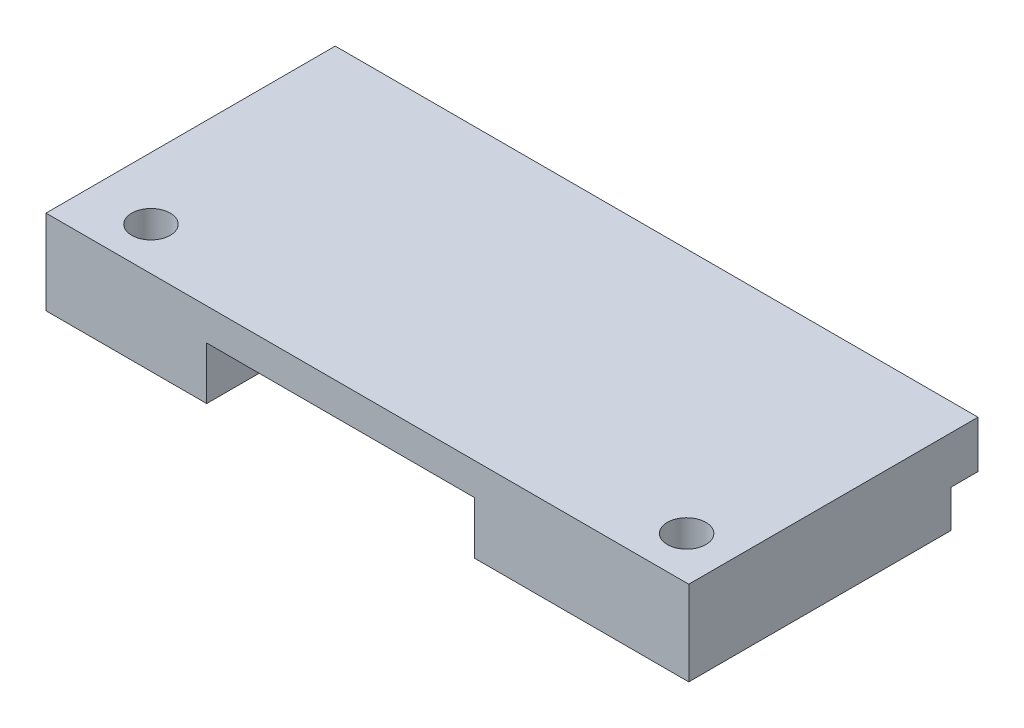
ISO-10303-21;
HEADER;
FILE_DESCRIPTION(('STEP AP214'),'2;1');
FILE_NAME('part.step','',(''),(''),'','','');
FILE_SCHEMA(('AUTOMOTIVE_DESIGN { 1 0 10303 214 1 1 1 1 }'));
ENDSEC;
DATA;
#1=APPLICATION_CONTEXT('core data for automotive mechanical design processes');
#2=APPLICATION_PROTOCOL_DEFINITION('international standard','automotive_design',2000,#1);
#3=PRODUCT_CONTEXT('',#1,'mechanical');
#4=PRODUCT('Part','Part','',(#3));
#5=PRODUCT_RELATED_PRODUCT_CATEGORY('part','',(#4));
#6=PRODUCT_DEFINITION_FORMATION('','',#4);
#7=PRODUCT_DEFINITION_CONTEXT('part definition',#1,'design');
#8=PRODUCT_DEFINITION('design','',#6,#7);
#9=PRODUCT_DEFINITION_SHAPE('','',#8);
#10=(LENGTH_UNIT() NAMED_UNIT(*) SI_UNIT(.MILLI.,.METRE.));
#11=(NAMED_UNIT(*) PLANE_ANGLE_UNIT() SI_UNIT($,.RADIAN.));
#12=(NAMED_UNIT(*) SI_UNIT($,.STERADIAN.) SOLID_ANGLE_UNIT());
#13=UNCERTAINTY_MEASURE_WITH_UNIT(LENGTH_MEASURE(1.E-05),#10,'distance_accuracy_value','');
#14=(GEOMETRIC_REPRESENTATION_CONTEXT(3) GLOBAL_UNCERTAINTY_ASSIGNED_CONTEXT((#13)) GLOBAL_UNIT_ASSIGNED_CONTEXT((#10,
#11,#12)) REPRESENTATION_CONTEXT('',''));
#15=CARTESIAN_POINT('',(0.,0.,0.));
#16=DIRECTION('',(0.,0.,1.));
#17=DIRECTION('',(1.,0.,0.));
#18=AXIS2_PLACEMENT_3D('',#15,#16,#17);
#19=CARTESIAN_POINT('',(30.,2.5,1.25));
#20=DIRECTION('',(-1.,0.,0.));
#21=DIRECTION('',(0.,0.,1.));
#22=AXIS2_PLACEMENT_3D('',#19,#20,#21);
#23=PLANE('',#22);
#24=DIRECTION('',(0.,0.,1.));
#25=VECTOR('',#24,1.);
#26=CARTESIAN_POINT('',(30.,3.5,-3.75));
#27=LINE('',#26,#25);
#28=CARTESIAN_POINT('',(30.,3.5,-3.75));
#29=VERTEX_POINT('',#28);
#30=CARTESIAN_POINT('',(30.,3.5,-1.25));
#31=VERTEX_POINT('',#30);
#32=EDGE_CURVE('E132',#29,#31,#27,.T.);
#33=ORIENTED_EDGE('',*,*,#32,.F.);
#34=DIRECTION('',(0.,-1.,0.));
#35=VECTOR('',#34,1.);
#36=CARTESIAN_POINT('',(30.,5.5,-3.75));
#37=LINE('',#36,#35);
#38=CARTESIAN_POINT('',(30.,7.9,-3.75));
#39=VERTEX_POINT('',#38);
#40=EDGE_CURVE('E148',#39,#29,#37,.T.);
#41=ORIENTED_EDGE('',*,*,#40,.F.);
#42=DIRECTION('',(0.,0.,-1.));
#43=VECTOR('',#42,1.);
#44=CARTESIAN_POINT('',(30.,7.9,23.25));
#45=LINE('',#44,#43);
#46=CARTESIAN_POINT('',(30.,7.9,23.25));
#47=VERTEX_POINT('',#46);
#48=EDGE_CURVE('E193',#47,#39,#45,.T.);
#49=ORIENTED_EDGE('',*,*,#48,.F.);
#50=DIRECTION('',(0.,1.,0.));
#51=VECTOR('',#50,1.);
#52=CARTESIAN_POINT('',(30.,0.,23.25));
#53=LINE('',#52,#51);
#54=CARTESIAN_POINT('',(30.,0.,23.25));
#55=VERTEX_POINT('',#54);
#56=EDGE_CURVE('E149',#55,#47,#53,.T.);
#57=ORIENTED_EDGE('',*,*,#56,.F.);
#58=DIRECTION('',(0.,0.,-1.));
#59=VECTOR('',#58,1.);
#60=CARTESIAN_POINT('',(30.,0.,1.25));
#61=LINE('',#60,#59);
#62=CARTESIAN_POINT('',(30.,0.,-1.25));
#63=VERTEX_POINT('',#62);
#64=EDGE_CURVE('E152',#55,#63,#61,.T.);
#65=ORIENTED_EDGE('',*,*,#64,.T.);
#66=DIRECTION('',(0.,-1.,0.));
#67=VECTOR('',#66,1.);
#68=CARTESIAN_POINT('',(30.,2.5,-1.25));
#69=LINE('',#68,#67);
#70=EDGE_CURVE('E168',#31,#63,#69,.T.);
#71=ORIENTED_EDGE('',*,*,#70,.F.);
#72=EDGE_LOOP('',(#33,#41,#49,#57,#65,#71));
#73=FACE_BOUND('',#72,.T.);
#74=ADVANCED_FACE('F33',(#73),#23,.F.);
#75=CARTESIAN_POINT('',(-30.,2.5,1.25));
#76=DIRECTION('',(1.,0.,0.));
#77=DIRECTION('',(0.,0.,-1.));
#78=AXIS2_PLACEMENT_3D('',#75,#76,#77);
#79=PLANE('',#78);
#80=DIRECTION('',(0.,0.,1.));
#81=VECTOR('',#80,1.);
#82=CARTESIAN_POINT('',(-30.,3.5,-3.75));
#83=LINE('',#82,#81);
#84=CARTESIAN_POINT('',(-30.,3.5,-3.75));
#85=VERTEX_POINT('',#84);
#86=CARTESIAN_POINT('',(-30.,3.5,-1.25));
#87=VERTEX_POINT('',#86);
#88=EDGE_CURVE('E123',#85,#87,#83,.T.);
#89=ORIENTED_EDGE('',*,*,#88,.T.);
#90=DIRECTION('',(0.,-1.,0.));
#91=VECTOR('',#90,1.);
#92=CARTESIAN_POINT('',(-30.,2.5,-1.25));
#93=LINE('',#92,#91);
#94=CARTESIAN_POINT('',(-30.,0.,-1.25));
#95=VERTEX_POINT('',#94);
#96=EDGE_CURVE('E166',#87,#95,#93,.T.);
#97=ORIENTED_EDGE('',*,*,#96,.T.);
#98=DIRECTION('',(0.,0.,1.));
#99=VECTOR('',#98,1.);
#100=CARTESIAN_POINT('',(-30.,0.,1.25));
#101=LINE('',#100,#99);
#102=CARTESIAN_POINT('',(-30.,0.,23.25));
#103=VERTEX_POINT('',#102);
#104=EDGE_CURVE('E164',#95,#103,#101,.T.);
#105=ORIENTED_EDGE('',*,*,#104,.T.);
#106=DIRECTION('',(0.,-1.,0.));
#107=VECTOR('',#106,1.);
#108=CARTESIAN_POINT('',(-30.,5.5,23.25));
#109=LINE('',#108,#107);
#110=CARTESIAN_POINT('',(-30.,7.9,23.25));
#111=VERTEX_POINT('',#110);
#112=EDGE_CURVE('E189',#111,#103,#109,.T.);
#113=ORIENTED_EDGE('',*,*,#112,.F.);
#114=DIRECTION('',(0.,0.,1.));
#115=VECTOR('',#114,1.);
#116=CARTESIAN_POINT('',(-30.,7.9,-3.75));
#117=LINE('',#116,#115);
#118=CARTESIAN_POINT('',(-30.,7.9,-3.75));
#119=VERTEX_POINT('',#118);
#120=EDGE_CURVE('E146',#119,#111,#117,.T.);
#121=ORIENTED_EDGE('',*,*,#120,.F.);
#122=DIRECTION('',(0.,-1.,0.));
#123=VECTOR('',#122,1.);
#124=CARTESIAN_POINT('',(-30.,5.5,-3.75));
#125=LINE('',#124,#123);
#126=EDGE_CURVE('E138',#119,#85,#125,.T.);
#127=ORIENTED_EDGE('',*,*,#126,.T.);
#128=EDGE_LOOP('',(#89,#97,#105,#113,#121,#127));
#129=FACE_BOUND('',#128,.T.);
#130=ADVANCED_FACE('F144',(#129),#79,.F.);
#131=CARTESIAN_POINT('',(-30.,5.5,-3.75));
#132=DIRECTION('',(0.,0.,1.));
#133=DIRECTION('',(1.,0.,0.));
#134=AXIS2_PLACEMENT_3D('',#131,#132,#133);
#135=PLANE('',#134);
#136=DIRECTION('',(1.,0.,0.));
#137=VECTOR('',#136,1.);
#138=CARTESIAN_POINT('',(30.,3.5,-3.75));
#139=LINE('',#138,#137);
#140=CARTESIAN_POINT('',(-15.,3.5,-3.75));
#141=VERTEX_POINT('',#140);
#142=EDGE_CURVE('E126',#85,#141,#139,.T.);
#143=ORIENTED_EDGE('',*,*,#142,.F.);
#144=ORIENTED_EDGE('',*,*,#126,.F.);
#145=DIRECTION('',(-1.,0.,0.));
#146=VECTOR('',#145,1.);
#147=CARTESIAN_POINT('',(30.,7.9,-3.75));
#148=LINE('',#147,#146);
#149=EDGE_CURVE('E200',#39,#119,#148,.T.);
#150=ORIENTED_EDGE('',*,*,#149,.F.);
#151=ORIENTED_EDGE('',*,*,#40,.T.);
#152=CARTESIAN_POINT('',(9.99999999999999,3.5,-3.75));
#153=VERTEX_POINT('',#152);
#154=EDGE_CURVE('E142',#153,#29,#139,.T.);
#155=ORIENTED_EDGE('',*,*,#154,.F.);
#156=DIRECTION('',(0.,-1.,0.));
#157=VECTOR('',#156,1.);
#158=CARTESIAN_POINT('',(9.99999999999999,4.9,-3.75));
#159=LINE('',#158,#157);
#160=CARTESIAN_POINT('',(9.99999999999999,4.9,-3.75));
#161=VERTEX_POINT('',#160);
#162=EDGE_CURVE('E226',#161,#153,#159,.T.);
#163=ORIENTED_EDGE('',*,*,#162,.F.);
#164=DIRECTION('',(1.,0.,0.));
#165=VECTOR('',#164,1.);
#166=CARTESIAN_POINT('',(9.99999999999999,4.9,-3.75));
#167=LINE('',#166,#165);
#168=CARTESIAN_POINT('',(-15.,4.9,-3.75));
#169=VERTEX_POINT('',#168);
#170=EDGE_CURVE('E221',#169,#161,#167,.T.);
#171=ORIENTED_EDGE('',*,*,#170,.F.);
#172=DIRECTION('',(0.,1.,0.));
#173=VECTOR('',#172,1.);
#174=CARTESIAN_POINT('',(-15.,4.9,-3.75));
#175=LINE('',#174,#173);
#176=EDGE_CURVE('E141',#141,#169,#175,.T.);
#177=ORIENTED_EDGE('',*,*,#176,.F.);
#178=EDGE_LOOP('',(#143,#144,#150,#151,#155,#163,#171,#177));
#179=FACE_BOUND('',#178,.T.);
#180=ADVANCED_FACE('F136',(#179),#135,.F.);
#181=CARTESIAN_POINT('',(9.99999999999999,4.9,23.25));
#182=DIRECTION('',(1.,0.,0.));
#183=DIRECTION('',(0.,1.,0.));
#184=AXIS2_PLACEMENT_3D('',#181,#182,#183);
#185=PLANE('',#184);
#186=DIRECTION('',(0.,0.,-1.));
#187=VECTOR('',#186,1.);
#188=CARTESIAN_POINT('',(9.99999999999999,3.5,23.25));
#189=LINE('',#188,#187);
#190=CARTESIAN_POINT('',(9.99999999999999,3.5,-1.25));
#191=VERTEX_POINT('',#190);
#192=EDGE_CURVE('E131',#191,#153,#189,.T.);
#193=ORIENTED_EDGE('',*,*,#192,.F.);
#194=DIRECTION('',(0.,1.,0.));
#195=VECTOR('',#194,1.);
#196=CARTESIAN_POINT('',(9.99999999999999,2.50000000000001,-1.25));
#197=LINE('',#196,#195);
#198=CARTESIAN_POINT('',(9.99999999999999,0.,-1.25));
#199=VERTEX_POINT('',#198);
#200=EDGE_CURVE('E184',#199,#191,#197,.T.);
#201=ORIENTED_EDGE('',*,*,#200,.F.);
#202=DIRECTION('',(0.,0.,1.));
#203=VECTOR('',#202,1.);
#204=CARTESIAN_POINT('',(9.99999999999999,0.,0.));
#205=LINE('',#204,#203);
#206=CARTESIAN_POINT('',(9.99999999999999,0.,23.25));
#207=VERTEX_POINT('',#206);
#208=EDGE_CURVE('E214',#199,#207,#205,.T.);
#209=ORIENTED_EDGE('',*,*,#208,.T.);
#210=DIRECTION('',(0.,-1.,0.));
#211=VECTOR('',#210,1.);
#212=CARTESIAN_POINT('',(9.99999999999999,4.9,23.25));
#213=LINE('',#212,#211);
#214=CARTESIAN_POINT('',(9.99999999999999,4.9,23.25));
#215=VERTEX_POINT('',#214);
#216=EDGE_CURVE('E224',#215,#207,#213,.T.);
#217=ORIENTED_EDGE('',*,*,#216,.F.);
#218=DIRECTION('',(0.,0.,-1.));
#219=VECTOR('',#218,1.);
#220=CARTESIAN_POINT('',(9.99999999999999,4.9,23.25));
#221=LINE('',#220,#219);
#222=EDGE_CURVE('E218',#215,#161,#221,.T.);
#223=ORIENTED_EDGE('',*,*,#222,.T.);
#224=ORIENTED_EDGE('',*,*,#162,.T.);
#225=EDGE_LOOP('',(#193,#201,#209,#217,#223,#224));
#226=FACE_BOUND('',#225,.T.);
#227=ADVANCED_FACE('F259',(#226),#185,.F.);
#228=CARTESIAN_POINT('',(-15.,4.9,23.25));
#229=DIRECTION('',(-1.,0.,0.));
#230=DIRECTION('',(0.,-1.,0.));
#231=AXIS2_PLACEMENT_3D('',#228,#229,#230);
#232=PLANE('',#231);
#233=DIRECTION('',(0.,0.,1.));
#234=VECTOR('',#233,1.);
#235=CARTESIAN_POINT('',(-15.,3.5,23.25));
#236=LINE('',#235,#234);
#237=CARTESIAN_POINT('',(-15.,3.5,-1.25));
#238=VERTEX_POINT('',#237);
#239=EDGE_CURVE('E11',#141,#238,#236,.T.);
#240=ORIENTED_EDGE('',*,*,#239,.F.);
#241=ORIENTED_EDGE('',*,*,#176,.T.);
#242=DIRECTION('',(0.,0.,-1.));
#243=VECTOR('',#242,1.);
#244=CARTESIAN_POINT('',(-15.,4.9,23.25));
#245=LINE('',#244,#243);
#246=CARTESIAN_POINT('',(-15.,4.9,23.25));
#247=VERTEX_POINT('',#246);
#248=EDGE_CURVE('E174',#247,#169,#245,.T.);
#249=ORIENTED_EDGE('',*,*,#248,.F.);
#250=DIRECTION('',(0.,-1.,0.));
#251=VECTOR('',#250,1.);
#252=CARTESIAN_POINT('',(-15.,0.,23.25));
#253=LINE('',#252,#251);
#254=CARTESIAN_POINT('',(-15.,0.,23.25));
#255=VERTEX_POINT('',#254);
#256=EDGE_CURVE('E40',#247,#255,#253,.T.);
#257=ORIENTED_EDGE('',*,*,#256,.T.);
#258=DIRECTION('',(0.,0.,-1.));
#259=VECTOR('',#258,1.);
#260=CARTESIAN_POINT('',(-15.,0.,0.));
#261=LINE('',#260,#259);
#262=CARTESIAN_POINT('',(-15.,0.,-1.25));
#263=VERTEX_POINT('',#262);
#264=EDGE_CURVE('E173',#255,#263,#261,.T.);
#265=ORIENTED_EDGE('',*,*,#264,.T.);
#266=DIRECTION('',(0.,-1.,0.));
#267=VECTOR('',#266,1.);
#268=CARTESIAN_POINT('',(-15.,2.5,-1.25));
#269=LINE('',#268,#267);
#270=EDGE_CURVE('E47',#238,#263,#269,.T.);
#271=ORIENTED_EDGE('',*,*,#270,.F.);
#272=EDGE_LOOP('',(#240,#241,#249,#257,#265,#271));
#273=FACE_BOUND('',#272,.T.);
#274=ADVANCED_FACE('F172',(#273),#232,.F.);
#275=CARTESIAN_POINT('',(-30.,2.5,-1.25));
#276=DIRECTION('',(0.,0.,1.));
#277=DIRECTION('',(1.,0.,0.));
#278=AXIS2_PLACEMENT_3D('',#275,#276,#277);
#279=PLANE('',#278);
#280=DIRECTION('',(-1.,0.,0.));
#281=VECTOR('',#280,1.);
#282=CARTESIAN_POINT('',(-30.,0.,-1.25));
#283=LINE('',#282,#281);
#284=EDGE_CURVE('E161',#63,#199,#283,.T.);
#285=ORIENTED_EDGE('',*,*,#284,.T.);
#286=ORIENTED_EDGE('',*,*,#200,.T.);
#287=DIRECTION('',(1.,0.,0.));
#288=VECTOR('',#287,1.);
#289=CARTESIAN_POINT('',(30.,3.5,-1.25));
#290=LINE('',#289,#288);
#291=EDGE_CURVE('E234',#191,#31,#290,.T.);
#292=ORIENTED_EDGE('',*,*,#291,.T.);
#293=ORIENTED_EDGE('',*,*,#70,.T.);
#294=EDGE_LOOP('',(#285,#286,#292,#293));
#295=FACE_BOUND('',#294,.T.);
#296=ADVANCED_FACE('F239',(#295),#279,.F.);
#297=CARTESIAN_POINT('',(0.,0.,0.));
#298=DIRECTION('',(0.,-1.,0.));
#299=DIRECTION('',(0.,0.,-1.));
#300=AXIS2_PLACEMENT_3D('',#297,#298,#299);
#301=PLANE('',#300);
#302=ORIENTED_EDGE('',*,*,#208,.F.);
#303=ORIENTED_EDGE('',*,*,#284,.F.);
#304=ORIENTED_EDGE('',*,*,#64,.F.);
#305=DIRECTION('',(1.,0.,0.));
#306=VECTOR('',#305,1.);
#307=CARTESIAN_POINT('',(-30.,0.,23.25));
#308=LINE('',#307,#306);
#309=EDGE_CURVE('E190',#207,#55,#308,.T.);
#310=ORIENTED_EDGE('',*,*,#309,.F.);
#311=EDGE_LOOP('',(#302,#303,#304,#310));
#312=FACE_BOUND('',#311,.T.);
#313=CARTESIAN_POINT('',(25.8,0.,19.25));
#314=DIRECTION('',(0.,1.,0.));
#315=DIRECTION('',(0.,0.,1.));
#316=AXIS2_PLACEMENT_3D('',#313,#314,#315);
#317=CIRCLE('',#316,1.8);
#318=CARTESIAN_POINT('',(25.8,0.,21.05));
#319=VERTEX_POINT('',#318);
#320=EDGE_CURVE('E202',#319,#319,#317,.T.);
#321=ORIENTED_EDGE('',*,*,#320,.T.);
#322=EDGE_LOOP('',(#321));
#323=FACE_BOUND('',#322,.T.);
#324=ADVANCED_FACE('F256',(#312,#323),#301,.T.);
#325=ORIENTED_EDGE('',*,*,#96,.F.);
#326=EDGE_CURVE('E127',#87,#238,#290,.T.);
#327=ORIENTED_EDGE('',*,*,#326,.T.);
#328=ORIENTED_EDGE('',*,*,#270,.T.);
#329=EDGE_CURVE('E160',#263,#95,#283,.T.);
#330=ORIENTED_EDGE('',*,*,#329,.T.);
#331=EDGE_LOOP('',(#325,#327,#328,#330));
#332=FACE_BOUND('',#331,.T.);
#333=ADVANCED_FACE('F283',(#332),#279,.F.);
#334=ORIENTED_EDGE('',*,*,#264,.F.);
#335=EDGE_CURVE('E154',#103,#255,#308,.T.);
#336=ORIENTED_EDGE('',*,*,#335,.F.);
#337=ORIENTED_EDGE('',*,*,#104,.F.);
#338=ORIENTED_EDGE('',*,*,#329,.F.);
#339=EDGE_LOOP('',(#334,#336,#337,#338));
#340=FACE_BOUND('',#339,.T.);
#341=CARTESIAN_POINT('',(-24.2,0.,19.25));
#342=DIRECTION('',(0.,1.,0.));
#343=DIRECTION('',(0.,0.,1.));
#344=AXIS2_PLACEMENT_3D('',#341,#342,#343);
#345=CIRCLE('',#344,1.8);
#346=CARTESIAN_POINT('',(-24.2,0.,21.05));
#347=VERTEX_POINT('',#346);
#348=EDGE_CURVE('E208',#347,#347,#345,.T.);
#349=ORIENTED_EDGE('',*,*,#348,.T.);
#350=EDGE_LOOP('',(#349));
#351=FACE_BOUND('',#350,.T.);
#352=ADVANCED_FACE('F180',(#340,#351),#301,.T.);
#353=CARTESIAN_POINT('',(0.,0.,23.25));
#354=DIRECTION('',(0.,0.,1.));
#355=DIRECTION('',(1.,0.,0.));
#356=AXIS2_PLACEMENT_3D('',#353,#354,#355);
#357=PLANE('',#356);
#358=ORIENTED_EDGE('',*,*,#216,.T.);
#359=ORIENTED_EDGE('',*,*,#309,.T.);
#360=ORIENTED_EDGE('',*,*,#56,.T.);
#361=DIRECTION('',(1.,0.,0.));
#362=VECTOR('',#361,1.);
#363=CARTESIAN_POINT('',(-30.,7.9,23.25));
#364=LINE('',#363,#362);
#365=EDGE_CURVE('E196',#111,#47,#364,.T.);
#366=ORIENTED_EDGE('',*,*,#365,.F.);
#367=ORIENTED_EDGE('',*,*,#112,.T.);
#368=ORIENTED_EDGE('',*,*,#335,.T.);
#369=ORIENTED_EDGE('',*,*,#256,.F.);
#370=DIRECTION('',(1.,0.,0.));
#371=VECTOR('',#370,1.);
#372=CARTESIAN_POINT('',(9.99999999999999,4.9,23.25));
#373=LINE('',#372,#371);
#374=EDGE_CURVE('E55',#247,#215,#373,.T.);
#375=ORIENTED_EDGE('',*,*,#374,.T.);
#376=EDGE_LOOP('',(#358,#359,#360,#366,#367,#368,#369,#375));
#377=FACE_BOUND('',#376,.T.);
#378=ADVANCED_FACE('F187',(#377),#357,.T.);
#379=CARTESIAN_POINT('',(0.,7.9,0.));
#380=DIRECTION('',(0.,1.,0.));
#381=DIRECTION('',(0.,0.,1.));
#382=AXIS2_PLACEMENT_3D('',#379,#380,#381);
#383=PLANE('',#382);
#384=CARTESIAN_POINT('',(-24.2,7.9,19.25));
#385=DIRECTION('',(0.,1.,0.));
#386=DIRECTION('',(0.,0.,1.));
#387=AXIS2_PLACEMENT_3D('',#384,#385,#386);
#388=CIRCLE('',#387,1.8);
#389=CARTESIAN_POINT('',(-24.2,7.9,21.05));
#390=VERTEX_POINT('',#389);
#391=EDGE_CURVE('E211',#390,#390,#388,.T.);
#392=ORIENTED_EDGE('',*,*,#391,.F.);
#393=EDGE_LOOP('',(#392));
#394=FACE_BOUND('',#393,.T.);
#395=CARTESIAN_POINT('',(25.8,7.9,19.25));
#396=DIRECTION('',(0.,1.,0.));
#397=DIRECTION('',(0.,0.,1.));
#398=AXIS2_PLACEMENT_3D('',#395,#396,#397);
#399=CIRCLE('',#398,1.8);
#400=CARTESIAN_POINT('',(25.8,7.9,21.05));
#401=VERTEX_POINT('',#400);
#402=EDGE_CURVE('E205',#401,#401,#399,.T.);
#403=ORIENTED_EDGE('',*,*,#402,.F.);
#404=EDGE_LOOP('',(#403));
#405=FACE_BOUND('',#404,.T.);
#406=ORIENTED_EDGE('',*,*,#149,.T.);
#407=ORIENTED_EDGE('',*,*,#120,.T.);
#408=ORIENTED_EDGE('',*,*,#365,.T.);
#409=ORIENTED_EDGE('',*,*,#48,.T.);
#410=EDGE_LOOP('',(#406,#407,#408,#409));
#411=FACE_BOUND('',#410,.T.);
#412=ADVANCED_FACE('F249',(#394,#405,#411),#383,.T.);
#413=CARTESIAN_POINT('',(25.8,7.9,19.25));
#414=DIRECTION('',(0.,1.,0.));
#415=DIRECTION('',(0.,0.,1.));
#416=AXIS2_PLACEMENT_3D('',#413,#414,#415);
#417=CYLINDRICAL_SURFACE('',#416,1.8);
#418=ORIENTED_EDGE('',*,*,#320,.F.);
#419=EDGE_LOOP('',(#418));
#420=FACE_BOUND('',#419,.T.);
#421=ORIENTED_EDGE('',*,*,#402,.T.);
#422=EDGE_LOOP('',(#421));
#423=FACE_BOUND('',#422,.T.);
#424=ADVANCED_FACE('F269',(#420,#423),#417,.F.);
#425=CARTESIAN_POINT('',(-24.2,7.9,19.25));
#426=DIRECTION('',(0.,1.,0.));
#427=DIRECTION('',(0.,0.,1.));
#428=AXIS2_PLACEMENT_3D('',#425,#426,#427);
#429=CYLINDRICAL_SURFACE('',#428,1.8);
#430=ORIENTED_EDGE('',*,*,#348,.F.);
#431=EDGE_LOOP('',(#430));
#432=FACE_BOUND('',#431,.T.);
#433=ORIENTED_EDGE('',*,*,#391,.T.);
#434=EDGE_LOOP('',(#433));
#435=FACE_BOUND('',#434,.T.);
#436=ADVANCED_FACE('F262',(#432,#435),#429,.F.);
#437=CARTESIAN_POINT('',(9.99999999999999,4.9,23.25));
#438=DIRECTION('',(0.,1.,0.));
#439=DIRECTION('',(-1.,0.,0.));
#440=AXIS2_PLACEMENT_3D('',#437,#438,#439);
#441=PLANE('',#440);
#442=ORIENTED_EDGE('',*,*,#170,.T.);
#443=ORIENTED_EDGE('',*,*,#222,.F.);
#444=ORIENTED_EDGE('',*,*,#374,.F.);
#445=ORIENTED_EDGE('',*,*,#248,.T.);
#446=EDGE_LOOP('',(#442,#443,#444,#445));
#447=FACE_BOUND('',#446,.T.);
#448=ADVANCED_FACE('F260',(#447),#441,.F.);
#449=CARTESIAN_POINT('',(30.,3.5,-3.75));
#450=DIRECTION('',(0.,-1.,0.));
#451=DIRECTION('',(0.,0.,-1.));
#452=AXIS2_PLACEMENT_3D('',#449,#450,#451);
#453=PLANE('',#452);
#454=ORIENTED_EDGE('',*,*,#239,.T.);
#455=ORIENTED_EDGE('',*,*,#326,.F.);
#456=ORIENTED_EDGE('',*,*,#88,.F.);
#457=ORIENTED_EDGE('',*,*,#142,.T.);
#458=EDGE_LOOP('',(#454,#455,#456,#457));
#459=FACE_BOUND('',#458,.T.);
#460=ADVANCED_FACE('F125',(#459),#453,.T.);
#461=ORIENTED_EDGE('',*,*,#192,.T.);
#462=ORIENTED_EDGE('',*,*,#154,.T.);
#463=ORIENTED_EDGE('',*,*,#32,.T.);
#464=ORIENTED_EDGE('',*,*,#291,.F.);
#465=EDGE_LOOP('',(#461,#462,#463,#464));
#466=FACE_BOUND('',#465,.T.);
#467=ADVANCED_FACE('F243',(#466),#453,.T.);
#468=CLOSED_SHELL('',(#74,#130,#180,#227,#274,#296,#324,#333,#352,#378,#412,#424,#436,#448,#460,#467));
#469=MANIFOLD_SOLID_BREP('B2',#468);
#470=ADVANCED_BREP_SHAPE_REPRESENTATION('',(#18,#469),#14);
#471=SHAPE_DEFINITION_REPRESENTATION(#9,#470);
ENDSEC;
END-ISO-10303-21;
